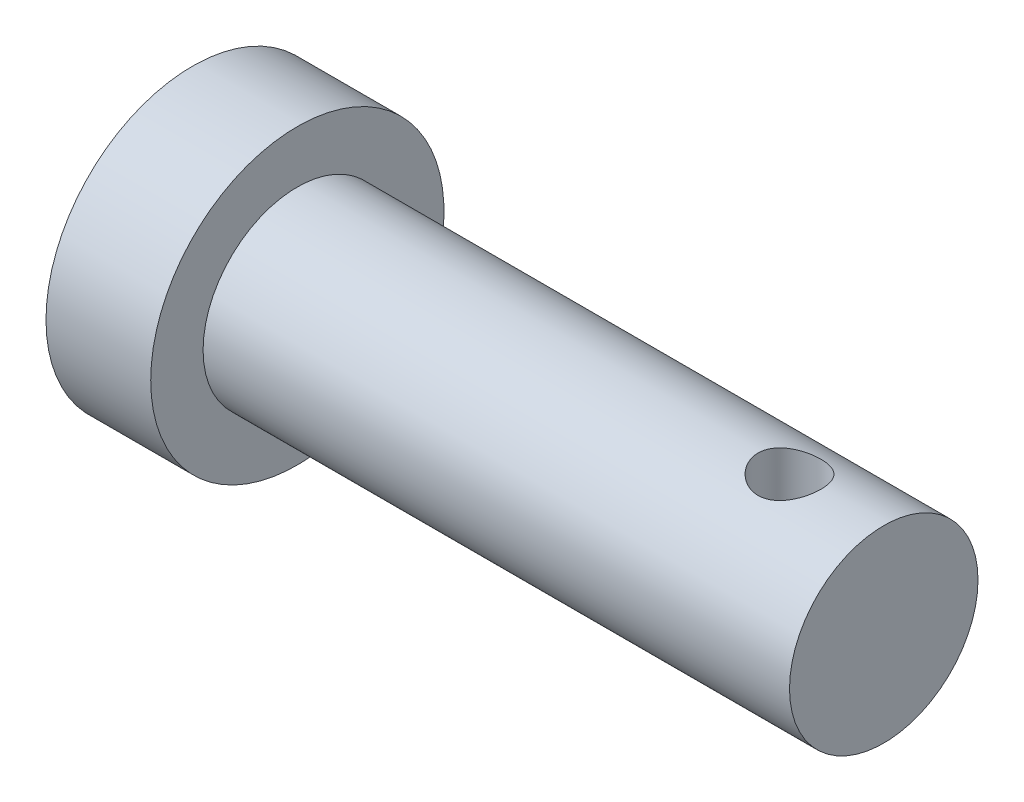
ISO-10303-21;
HEADER;
FILE_DESCRIPTION(('STEP AP214'),'2;1');
FILE_NAME('part.step','',(''),(''),'','','');
FILE_SCHEMA(('AUTOMOTIVE_DESIGN { 1 0 10303 214 1 1 1 1 }'));
ENDSEC;
DATA;
#1=APPLICATION_CONTEXT('core data for automotive mechanical design processes');
#2=APPLICATION_PROTOCOL_DEFINITION('international standard','automotive_design',2000,#1);
#3=PRODUCT_CONTEXT('',#1,'mechanical');
#4=PRODUCT('Part','Part','',(#3));
#5=PRODUCT_RELATED_PRODUCT_CATEGORY('part','',(#4));
#6=PRODUCT_DEFINITION_FORMATION('','',#4);
#7=PRODUCT_DEFINITION_CONTEXT('part definition',#1,'design');
#8=PRODUCT_DEFINITION('design','',#6,#7);
#9=PRODUCT_DEFINITION_SHAPE('','',#8);
#10=(LENGTH_UNIT() NAMED_UNIT(*) SI_UNIT(.MILLI.,.METRE.));
#11=(NAMED_UNIT(*) PLANE_ANGLE_UNIT() SI_UNIT($,.RADIAN.));
#12=(NAMED_UNIT(*) SI_UNIT($,.STERADIAN.) SOLID_ANGLE_UNIT());
#13=UNCERTAINTY_MEASURE_WITH_UNIT(LENGTH_MEASURE(1.E-05),#10,'distance_accuracy_value','');
#14=(GEOMETRIC_REPRESENTATION_CONTEXT(3) GLOBAL_UNCERTAINTY_ASSIGNED_CONTEXT((#13)) GLOBAL_UNIT_ASSIGNED_CONTEXT((#10,
#11,#12)) REPRESENTATION_CONTEXT('',''));
#15=CARTESIAN_POINT('',(0.,0.,0.));
#16=DIRECTION('',(0.,0.,1.));
#17=DIRECTION('',(1.,0.,0.));
#18=AXIS2_PLACEMENT_3D('',#15,#16,#17);
#19=CARTESIAN_POINT('',(33.,0.,0.));
#20=DIRECTION('',(-1.,0.,0.));
#21=DIRECTION('',(0.,0.,1.));
#22=AXIS2_PLACEMENT_3D('',#19,#20,#21);
#23=CYLINDRICAL_SURFACE('',#22,4.5);
#24=CARTESIAN_POINT('',(28.5,-4.24264068711928,1.5));
#25=CARTESIAN_POINT('',(28.5817022622541,-4.24264041795651,1.50000038692157));
#26=CARTESIAN_POINT('',(28.6634021997354,-4.24502653936286,1.49330217552828));
#27=CARTESIAN_POINT('',(28.8243816314914,-4.25426361121882,1.46677669753321));
#28=CARTESIAN_POINT('',(28.9036607248087,-4.26111529713283,1.4469472682526));
#29=CARTESIAN_POINT('',(29.0574403394959,-4.27842305533187,1.39493322852736));
#30=CARTESIAN_POINT('',(29.1319498941641,-4.28887205956983,1.36277283210487));
#31=CARTESIAN_POINT('',(29.2745400728219,-4.31218683015487,1.28709244266207));
#32=CARTESIAN_POINT('',(29.3426192738304,-4.32505312955418,1.24356994329028));
#33=CARTESIAN_POINT('',(29.4730799435075,-4.3523173411121,1.14457671966432));
#34=CARTESIAN_POINT('',(29.5351731430076,-4.36675342266966,1.08873651206688));
#35=CARTESIAN_POINT('',(29.649310201837,-4.39520797201504,0.967481500821593));
#36=CARTESIAN_POINT('',(29.7013524473736,-4.40922637243442,0.902065162578564));
#37=CARTESIAN_POINT('',(29.7952183459944,-4.43570800382698,0.761406761947515));
#38=CARTESIAN_POINT('',(29.8367399559269,-4.44812111552408,0.685952866836788));
#39=CARTESIAN_POINT('',(29.9063873776913,-4.46954380156474,0.528646834481211));
#40=CARTESIAN_POINT('',(29.9345167997654,-4.47855429304502,0.446796428530819));
#41=CARTESIAN_POINT('',(29.9756037819486,-4.4918861314786,0.282043226150241));
#42=CARTESIAN_POINT('',(29.9890551693855,-4.49635972166341,0.199276132279451));
#43=CARTESIAN_POINT('',(30.001974440041,-4.5006541232737,0.0325468122361355));
#44=CARTESIAN_POINT('',(30.0014459274786,-4.50047613394335,-0.0514151003158399));
#45=CARTESIAN_POINT('',(29.986733618151,-4.49559059428104,-0.214655272790726));
#46=CARTESIAN_POINT('',(29.9730862072882,-4.49106097132703,-0.2939880728875));
#47=CARTESIAN_POINT('',(29.9334105285293,-4.4782045100957,-0.44916515823324));
#48=CARTESIAN_POINT('',(29.9073814215304,-4.46987741446672,-0.525009206668763));
#49=CARTESIAN_POINT('',(29.8433680240408,-4.45013505439938,-0.672228712263021));
#50=CARTESIAN_POINT('',(29.8052310921798,-4.43868063786404,-0.743532331453497));
#51=CARTESIAN_POINT('',(29.7182104418274,-4.41387589557997,-0.878886488290754));
#52=CARTESIAN_POINT('',(29.66932373501,-4.40052504300777,-0.942935001577154));
#53=CARTESIAN_POINT('',(29.5594884098089,-4.37259287776335,-1.06515129982786));
#54=CARTESIAN_POINT('',(29.4980802632318,-4.35798322759,-1.12290023560133));
#55=CARTESIAN_POINT('',(29.366326911416,-4.32971002867666,-1.22741588939383));
#56=CARTESIAN_POINT('',(29.2959803314301,-4.31604662597174,-1.27418091490951));
#57=CARTESIAN_POINT('',(29.1470195615769,-4.29105787703296,-1.3559811825641));
#58=CARTESIAN_POINT('',(29.0683018029483,-4.27976864008232,-1.39083969547657));
#59=CARTESIAN_POINT('',(28.9056429086006,-4.26122476317448,-1.44666478994926));
#60=CARTESIAN_POINT('',(28.8217039781673,-4.25396843251835,-1.4676371936333));
#61=CARTESIAN_POINT('',(28.6550424668991,-4.24469454453105,-1.49424192313571));
#62=CARTESIAN_POINT('',(28.5724358628814,-4.24245540472709,-1.50052364325862));
#63=CARTESIAN_POINT('',(28.4073357763244,-4.242850080942,-1.49940815836741));
#64=CARTESIAN_POINT('',(28.3248422759629,-4.24548301189152,-1.49201343784089));
#65=CARTESIAN_POINT('',(28.1652645514333,-4.25510427134068,-1.46433847732775));
#66=CARTESIAN_POINT('',(28.088091854774,-4.2619398816089,-1.44450959097083));
#67=CARTESIAN_POINT('',(27.9381845906409,-4.27902830506905,-1.39307079384089));
#68=CARTESIAN_POINT('',(27.8654508126137,-4.2892817240236,-1.36145879454519));
#69=CARTESIAN_POINT('',(27.7239293687296,-4.31245316393576,-1.28621151110835));
#70=CARTESIAN_POINT('',(27.6553400360373,-4.32544538498414,-1.24222667753773));
#71=CARTESIAN_POINT('',(27.5262809214244,-4.35248653096476,-1.14387844583635));
#72=CARTESIAN_POINT('',(27.4658135420082,-4.36653576665699,-1.08951198824818));
#73=CARTESIAN_POINT('',(27.3517080238641,-4.39492557956765,-0.968837558850486));
#74=CARTESIAN_POINT('',(27.2985384149717,-4.40924765366842,-0.902080905819979));
#75=CARTESIAN_POINT('',(27.2041257864779,-4.43590277419665,-0.760240937100387));
#76=CARTESIAN_POINT('',(27.1628823432564,-4.44823589126543,-0.68515791729683));
#77=CARTESIAN_POINT('',(27.0938698427074,-4.46946608715904,-0.529169793648443));
#78=CARTESIAN_POINT('',(27.0660130842779,-4.47838545006796,-0.448306684981794));
#79=CARTESIAN_POINT('',(27.0244083869098,-4.49187916256662,-0.282687698769023));
#80=CARTESIAN_POINT('',(27.0106553551792,-4.49645508051028,-0.197933237930833));
#81=CARTESIAN_POINT('',(26.9981068835915,-4.50062794854384,-0.0312230037900603));
#82=CARTESIAN_POINT('',(26.9986388191014,-4.50044880134159,0.0506770858800288));
#83=CARTESIAN_POINT('',(27.0129859622196,-4.49568294779097,0.213166717500262));
#84=CARTESIAN_POINT('',(27.0268000922292,-4.49109659900363,0.293756365228586));
#85=CARTESIAN_POINT('',(27.0668733518639,-4.47811372431618,0.450063179148089));
#86=CARTESIAN_POINT('',(27.0929313230294,-4.46977887541723,0.525837406369185));
#87=CARTESIAN_POINT('',(27.1565662966457,-4.45015741056742,0.671967526409695));
#88=CARTESIAN_POINT('',(27.1941453827955,-4.43887026072025,0.74232243621365));
#89=CARTESIAN_POINT('',(27.281354268153,-4.41398803241821,0.87845102446318));
#90=CARTESIAN_POINT('',(27.3313780280725,-4.4003230873789,0.943959377336414));
#91=CARTESIAN_POINT('',(27.4413860867343,-4.37239483187819,1.06587153940864));
#92=CARTESIAN_POINT('',(27.5013735633941,-4.35813133159646,1.12227243243689));
#93=CARTESIAN_POINT('',(27.6324140333804,-4.32994919738397,1.22661271324968));
#94=CARTESIAN_POINT('',(27.703808266465,-4.31606591982946,1.27413444899685));
#95=CARTESIAN_POINT('',(27.8540016403542,-4.29090289984523,1.35647151495167));
#96=CARTESIAN_POINT('',(27.9327988395445,-4.27962247741874,1.39129016522921));
#97=CARTESIAN_POINT('',(28.0919427360234,-4.26152001309772,1.44576574230625));
#98=CARTESIAN_POINT('',(28.172058395288,-4.25451949285773,1.46603686372428));
#99=CARTESIAN_POINT('',(28.3347840757001,-4.24508075309277,1.4931514802239));
#100=CARTESIAN_POINT('',(28.4173932261161,-4.24264095926191,1.49999960879489));
#101=CARTESIAN_POINT('',(28.5,-4.24264068711928,1.5));
#102=B_SPLINE_CURVE_WITH_KNOTS('',3,(#24,#25,#26,#27,#28,#29,#30,#31,#32,#33,#34,#35,#36,#37,
#38,#39,#40,#41,#42,#43,#44,#45,#46,#47,#48,#49,#50,#51,#52,#53,#54,#55,#56,#57,#58,#59,#60,#61,
#62,#63,#64,#65,#66,#67,#68,#69,#70,#71,#72,#73,#74,#75,#76,#77,#78,#79,#80,#81,#82,#83,#84,#85,
#86,#87,#88,#89,#90,#91,#92,#93,#94,#95,#96,#97,#98,#99,#100,#101),.UNSPECIFIED.,.T.,.F.,(4,2,2,
2,2,2,2,2,2,2,2,2,2,2,2,2,2,2,2,2,2,2,2,2,2,2,2,2,2,2,2,2,2,2,2,2,2,2,4),(0.,0.244800877199035,
0.489642082522746,0.73400494125124,0.978421749278162,1.23152006141352,1.48465897757982,
1.74440259215486,2.00407614580184,2.25471478147401,2.50528879953491,2.74603507238353,
2.98679766283855,3.23072482290503,3.47471987811033,3.73020261545876,3.98572469418159,
4.24488959763007,4.50394577031476,4.75131437043212,4.99863803752403,5.23746593649716,
5.47633618716971,5.72278286600124,5.96930228489743,6.22768212253191,6.48605278132851,
6.7427068678283,6.99926824502787,7.24377127013005,7.48825446011224,7.72885434057197,
7.96949776141416,8.21903279277503,8.468647566455,8.72803354100769,8.98735167396852,
9.23494818240588,9.48245920782248),.UNSPECIFIED.);
#103=CARTESIAN_POINT('',(28.5,-4.24264068711928,1.5));
#104=VERTEX_POINT('',#103);
#105=EDGE_CURVE('E38',#104,#104,#102,.T.);
#106=ORIENTED_EDGE('',*,*,#105,.T.);
#107=EDGE_LOOP('',(#106));
#108=FACE_BOUND('',#107,.T.);
#109=CARTESIAN_POINT('',(28.5,4.24264068711928,1.5));
#110=CARTESIAN_POINT('',(28.4182977377459,4.24264041795651,1.50000038692157));
#111=CARTESIAN_POINT('',(28.3365978002646,4.24502653936286,1.49330217552828));
#112=CARTESIAN_POINT('',(28.1756183685086,4.25426361121882,1.46677669753321));
#113=CARTESIAN_POINT('',(28.0963392751913,4.26111529713283,1.4469472682526));
#114=CARTESIAN_POINT('',(27.9425596605041,4.27842305533187,1.39493322852736));
#115=CARTESIAN_POINT('',(27.8680501058359,4.28887205956983,1.36277283210487));
#116=CARTESIAN_POINT('',(27.7254599271781,4.31218683015487,1.28709244266207));
#117=CARTESIAN_POINT('',(27.6573807261696,4.32505312955418,1.24356994329028));
#118=CARTESIAN_POINT('',(27.5269200564925,4.3523173411121,1.14457671966432));
#119=CARTESIAN_POINT('',(27.4648268569924,4.36675342266966,1.08873651206688));
#120=CARTESIAN_POINT('',(27.350689798163,4.39520797201504,0.967481500821593));
#121=CARTESIAN_POINT('',(27.2986475526264,4.40922637243442,0.902065162578564));
#122=CARTESIAN_POINT('',(27.2047816540056,4.43570800382698,0.761406761947515));
#123=CARTESIAN_POINT('',(27.1632600440731,4.44812111552408,0.685952866836788));
#124=CARTESIAN_POINT('',(27.0936126223087,4.46954380156474,0.528646834481211));
#125=CARTESIAN_POINT('',(27.0654832002346,4.47855429304502,0.446796428530819));
#126=CARTESIAN_POINT('',(27.0243962180514,4.4918861314786,0.282043226150241));
#127=CARTESIAN_POINT('',(27.0109448306145,4.49635972166341,0.199276132279451));
#128=CARTESIAN_POINT('',(26.998025559959,4.5006541232737,0.0325468122361353));
#129=CARTESIAN_POINT('',(26.9985540725214,4.50047613394335,-0.05141510031584));
#130=CARTESIAN_POINT('',(27.013266381849,4.49559059428104,-0.214655272790726));
#131=CARTESIAN_POINT('',(27.0269137927118,4.49106097132703,-0.293988072887501));
#132=CARTESIAN_POINT('',(27.0665894714707,4.4782045100957,-0.449165158233241));
#133=CARTESIAN_POINT('',(27.0926185784696,4.46987741446672,-0.525009206668763));
#134=CARTESIAN_POINT('',(27.1566319759592,4.45013505439938,-0.672228712263021));
#135=CARTESIAN_POINT('',(27.1947689078202,4.43868063786404,-0.743532331453497));
#136=CARTESIAN_POINT('',(27.2817895581726,4.41387589557997,-0.878886488290754));
#137=CARTESIAN_POINT('',(27.33067626499,4.40052504300777,-0.942935001577154));
#138=CARTESIAN_POINT('',(27.4405115901911,4.37259287776335,-1.06515129982786));
#139=CARTESIAN_POINT('',(27.5019197367682,4.35798322759,-1.12290023560133));
#140=CARTESIAN_POINT('',(27.633673088584,4.32971002867666,-1.22741588939383));
#141=CARTESIAN_POINT('',(27.7040196685699,4.31604662597174,-1.27418091490951));
#142=CARTESIAN_POINT('',(27.8529804384231,4.29105787703296,-1.3559811825641));
#143=CARTESIAN_POINT('',(27.9316981970517,4.27976864008232,-1.39083969547657));
#144=CARTESIAN_POINT('',(28.0943570913994,4.26122476317448,-1.44666478994926));
#145=CARTESIAN_POINT('',(28.1782960218327,4.25396843251835,-1.4676371936333));
#146=CARTESIAN_POINT('',(28.3449575331009,4.24469454453105,-1.49424192313571));
#147=CARTESIAN_POINT('',(28.4275641371186,4.24245540472709,-1.50052364325862));
#148=CARTESIAN_POINT('',(28.5926642236756,4.242850080942,-1.49940815836741));
#149=CARTESIAN_POINT('',(28.6751577240371,4.24548301189152,-1.49201343784089));
#150=CARTESIAN_POINT('',(28.8347354485668,4.25510427134068,-1.46433847732775));
#151=CARTESIAN_POINT('',(28.911908145226,4.2619398816089,-1.44450959097083));
#152=CARTESIAN_POINT('',(29.0618154093591,4.27902830506905,-1.39307079384089));
#153=CARTESIAN_POINT('',(29.1345491873863,4.2892817240236,-1.36145879454519));
#154=CARTESIAN_POINT('',(29.2760706312704,4.31245316393576,-1.28621151110835));
#155=CARTESIAN_POINT('',(29.3446599639627,4.32544538498414,-1.24222667753773));
#156=CARTESIAN_POINT('',(29.4737190785756,4.35248653096475,-1.14387844583635));
#157=CARTESIAN_POINT('',(29.5341864579918,4.36653576665699,-1.08951198824818));
#158=CARTESIAN_POINT('',(29.648291976136,4.39492557956765,-0.968837558850486));
#159=CARTESIAN_POINT('',(29.7014615850283,4.40924765366842,-0.902080905819979));
#160=CARTESIAN_POINT('',(29.7958742135221,4.43590277419665,-0.760240937100387));
#161=CARTESIAN_POINT('',(29.8371176567436,4.44823589126543,-0.685157917296829));
#162=CARTESIAN_POINT('',(29.9061301572926,4.46946608715904,-0.529169793648443));
#163=CARTESIAN_POINT('',(29.9339869157221,4.47838545006796,-0.448306684981794));
#164=CARTESIAN_POINT('',(29.9755916130902,4.49187916256662,-0.282687698769023));
#165=CARTESIAN_POINT('',(29.9893446448208,4.49645508051028,-0.197933237930833));
#166=CARTESIAN_POINT('',(30.0018931164085,4.50062794854384,-0.0312230037900603));
#167=CARTESIAN_POINT('',(30.0013611808986,4.50044880134159,0.0506770858800288));
#168=CARTESIAN_POINT('',(29.9870140377804,4.49568294779097,0.213166717500262));
#169=CARTESIAN_POINT('',(29.9731999077709,4.49109659900363,0.293756365228586));
#170=CARTESIAN_POINT('',(29.9331266481361,4.47811372431618,0.450063179148089));
#171=CARTESIAN_POINT('',(29.9070686769706,4.46977887541723,0.525837406369185));
#172=CARTESIAN_POINT('',(29.8434337033543,4.45015741056742,0.671967526409695));
#173=CARTESIAN_POINT('',(29.8058546172045,4.43887026072025,0.74232243621365));
#174=CARTESIAN_POINT('',(29.718645731847,4.41398803241821,0.87845102446318));
#175=CARTESIAN_POINT('',(29.6686219719275,4.4003230873789,0.943959377336413));
#176=CARTESIAN_POINT('',(29.5586139132657,4.37239483187819,1.06587153940864));
#177=CARTESIAN_POINT('',(29.4986264366059,4.35813133159646,1.12227243243689));
#178=CARTESIAN_POINT('',(29.3675859666196,4.32994919738397,1.22661271324968));
#179=CARTESIAN_POINT('',(29.296191733535,4.31606591982946,1.27413444899685));
#180=CARTESIAN_POINT('',(29.1459983596458,4.29090289984523,1.35647151495167));
#181=CARTESIAN_POINT('',(29.0672011604555,4.27962247741874,1.39129016522921));
#182=CARTESIAN_POINT('',(28.9080572639766,4.26152001309772,1.44576574230625));
#183=CARTESIAN_POINT('',(28.827941604712,4.25451949285773,1.46603686372428));
#184=CARTESIAN_POINT('',(28.6652159243,4.24508075309277,1.4931514802239));
#185=CARTESIAN_POINT('',(28.5826067738839,4.24264095926191,1.49999960879489));
#186=CARTESIAN_POINT('',(28.5,4.24264068711928,1.5));
#187=B_SPLINE_CURVE_WITH_KNOTS('',3,(#109,#110,#111,#112,#113,#114,#115,#116,#117,#118,#119,
#120,#121,#122,#123,#124,#125,#126,#127,#128,#129,#130,#131,#132,#133,#134,#135,#136,#137,#138,
#139,#140,#141,#142,#143,#144,#145,#146,#147,#148,#149,#150,#151,#152,#153,#154,#155,#156,#157,
#158,#159,#160,#161,#162,#163,#164,#165,#166,#167,#168,#169,#170,#171,#172,#173,#174,#175,#176,
#177,#178,#179,#180,#181,#182,#183,#184,#185,#186),.UNSPECIFIED.,.T.,.F.,(4,2,2,2,2,2,2,2,2,2,2,
2,2,2,2,2,2,2,2,2,2,2,2,2,2,2,2,2,2,2,2,2,2,2,2,2,2,2,4),(0.,0.244800877199035,
0.489642082522746,0.73400494125124,0.978421749278162,1.23152006141352,1.48465897757982,
1.74440259215486,2.00407614580184,2.25471478147401,2.50528879953491,2.74603507238353,
2.98679766283855,3.23072482290503,3.47471987811033,3.73020261545876,3.98572469418159,
4.24488959763007,4.50394577031476,4.75131437043212,4.99863803752403,5.23746593649716,
5.47633618716971,5.72278286600124,5.96930228489743,6.22768212253191,6.48605278132851,
6.7427068678283,6.99926824502787,7.24377127013005,7.48825446011224,7.72885434057197,
7.96949776141416,8.21903279277503,8.468647566455,8.72803354100769,8.98735167396852,
9.23494818240588,9.48245920782248),.UNSPECIFIED.);
#188=CARTESIAN_POINT('',(28.5,4.24264068711928,1.5));
#189=VERTEX_POINT('',#188);
#190=EDGE_CURVE('E53',#189,#189,#187,.T.);
#191=ORIENTED_EDGE('',*,*,#190,.T.);
#192=EDGE_LOOP('',(#191));
#193=FACE_BOUND('',#192,.T.);
#194=CARTESIAN_POINT('',(33.,0.,0.));
#195=DIRECTION('',(1.,0.,0.));
#196=DIRECTION('',(0.,0.,-1.));
#197=AXIS2_PLACEMENT_3D('',#194,#195,#196);
#198=CIRCLE('',#197,4.5);
#199=CARTESIAN_POINT('',(33.,0.,-4.5));
#200=VERTEX_POINT('',#199);
#201=EDGE_CURVE('E45',#200,#200,#198,.T.);
#202=ORIENTED_EDGE('',*,*,#201,.F.);
#203=EDGE_LOOP('',(#202));
#204=FACE_BOUND('',#203,.T.);
#205=CARTESIAN_POINT('',(5.,0.,0.));
#206=DIRECTION('',(-1.,0.,0.));
#207=DIRECTION('',(0.,0.,1.));
#208=AXIS2_PLACEMENT_3D('',#205,#206,#207);
#209=CIRCLE('',#208,4.5);
#210=CARTESIAN_POINT('',(5.,0.,4.5));
#211=VERTEX_POINT('',#210);
#212=EDGE_CURVE('E10',#211,#211,#209,.T.);
#213=ORIENTED_EDGE('',*,*,#212,.F.);
#214=EDGE_LOOP('',(#213));
#215=FACE_BOUND('',#214,.T.);
#216=ADVANCED_FACE('F34',(#108,#193,#204,#215),#23,.T.);
#217=CARTESIAN_POINT('',(33.,0.,0.));
#218=DIRECTION('',(1.,0.,0.));
#219=DIRECTION('',(0.,0.,-1.));
#220=AXIS2_PLACEMENT_3D('',#217,#218,#219);
#221=PLANE('',#220);
#222=ORIENTED_EDGE('',*,*,#201,.T.);
#223=EDGE_LOOP('',(#222));
#224=FACE_BOUND('',#223,.T.);
#225=ADVANCED_FACE('F70',(#224),#221,.T.);
#226=CARTESIAN_POINT('',(5.,0.,0.));
#227=DIRECTION('',(-1.,0.,0.));
#228=DIRECTION('',(0.,0.,1.));
#229=AXIS2_PLACEMENT_3D('',#226,#227,#228);
#230=CYLINDRICAL_SURFACE('',#229,7.);
#231=CARTESIAN_POINT('',(5.,0.,0.));
#232=DIRECTION('',(-1.,0.,0.));
#233=DIRECTION('',(0.,0.,1.));
#234=AXIS2_PLACEMENT_3D('',#231,#232,#233);
#235=CIRCLE('',#234,7.);
#236=CARTESIAN_POINT('',(5.,0.,7.));
#237=VERTEX_POINT('',#236);
#238=EDGE_CURVE('E50',#237,#237,#235,.T.);
#239=ORIENTED_EDGE('',*,*,#238,.T.);
#240=EDGE_LOOP('',(#239));
#241=FACE_BOUND('',#240,.T.);
#242=CARTESIAN_POINT('',(0.,0.,0.));
#243=DIRECTION('',(-1.,0.,0.));
#244=DIRECTION('',(0.,0.,1.));
#245=AXIS2_PLACEMENT_3D('',#242,#243,#244);
#246=CIRCLE('',#245,7.);
#247=CARTESIAN_POINT('',(0.,0.,7.));
#248=VERTEX_POINT('',#247);
#249=EDGE_CURVE('E91',#248,#248,#246,.T.);
#250=ORIENTED_EDGE('',*,*,#249,.F.);
#251=EDGE_LOOP('',(#250));
#252=FACE_BOUND('',#251,.T.);
#253=ADVANCED_FACE('F67',(#241,#252),#230,.T.);
#254=CARTESIAN_POINT('',(5.,0.,0.));
#255=DIRECTION('',(-1.,0.,0.));
#256=DIRECTION('',(0.,0.,1.));
#257=AXIS2_PLACEMENT_3D('',#254,#255,#256);
#258=PLANE('',#257);
#259=ORIENTED_EDGE('',*,*,#212,.T.);
#260=EDGE_LOOP('',(#259));
#261=FACE_BOUND('',#260,.T.);
#262=ORIENTED_EDGE('',*,*,#238,.F.);
#263=EDGE_LOOP('',(#262));
#264=FACE_BOUND('',#263,.T.);
#265=ADVANCED_FACE('F63',(#261,#264),#258,.F.);
#266=CARTESIAN_POINT('',(0.,0.,0.));
#267=DIRECTION('',(1.,0.,0.));
#268=DIRECTION('',(0.,0.,-1.));
#269=AXIS2_PLACEMENT_3D('',#266,#267,#268);
#270=PLANE('',#269);
#271=ORIENTED_EDGE('',*,*,#249,.T.);
#272=EDGE_LOOP('',(#271));
#273=FACE_BOUND('',#272,.T.);
#274=ADVANCED_FACE('F61',(#273),#270,.F.);
#275=CARTESIAN_POINT('',(28.5,-7.,0.));
#276=DIRECTION('',(0.,1.,0.));
#277=DIRECTION('',(0.,0.,1.));
#278=AXIS2_PLACEMENT_3D('',#275,#276,#277);
#279=CYLINDRICAL_SURFACE('',#278,1.5);
#280=ORIENTED_EDGE('',*,*,#190,.F.);
#281=EDGE_LOOP('',(#280));
#282=FACE_BOUND('',#281,.T.);
#283=ORIENTED_EDGE('',*,*,#105,.F.);
#284=EDGE_LOOP('',(#283));
#285=FACE_BOUND('',#284,.T.);
#286=ADVANCED_FACE('F57',(#282,#285),#279,.F.);
#287=CLOSED_SHELL('',(#216,#225,#253,#265,#274,#286));
#288=MANIFOLD_SOLID_BREP('B2',#287);
#289=ADVANCED_BREP_SHAPE_REPRESENTATION('',(#18,#288),#14);
#290=SHAPE_DEFINITION_REPRESENTATION(#9,#289);
ENDSEC;
END-ISO-10303-21;
